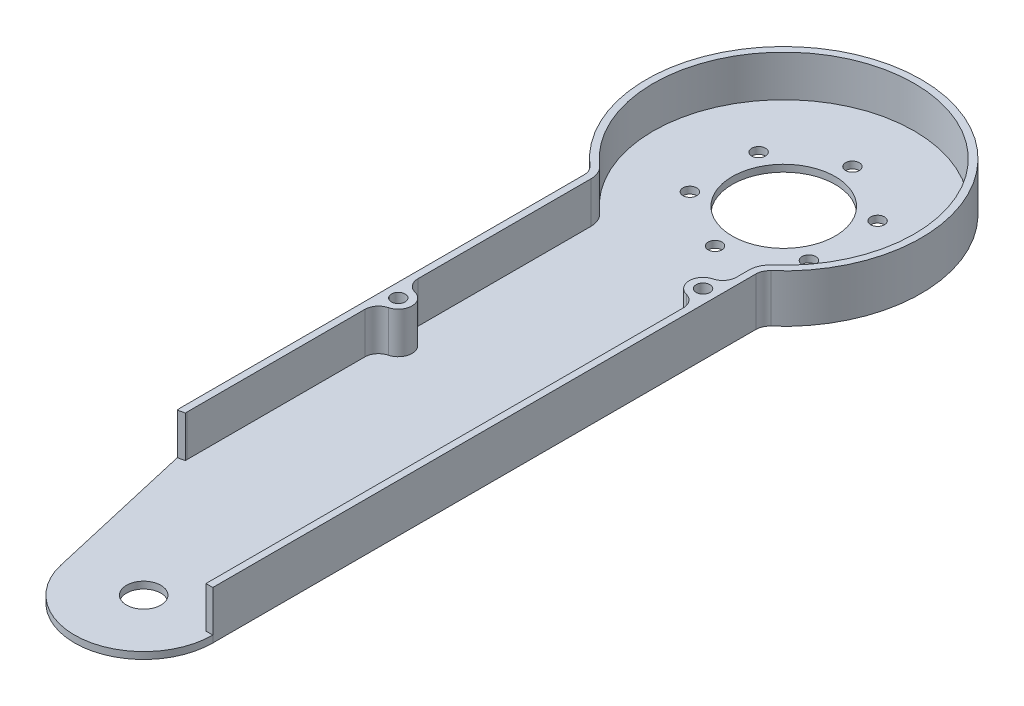
ISO-10303-21;
HEADER;
FILE_DESCRIPTION(('STEP AP214'),'2;1');
FILE_NAME('part.step','',(''),(''),'','','');
FILE_SCHEMA(('AUTOMOTIVE_DESIGN { 1 0 10303 214 1 1 1 1 }'));
ENDSEC;
DATA;
#1=APPLICATION_CONTEXT('core data for automotive mechanical design processes');
#2=APPLICATION_PROTOCOL_DEFINITION('international standard','automotive_design',2000,#1);
#3=PRODUCT_CONTEXT('',#1,'mechanical');
#4=PRODUCT('Part','Part','',(#3));
#5=PRODUCT_RELATED_PRODUCT_CATEGORY('part','',(#4));
#6=PRODUCT_DEFINITION_FORMATION('','',#4);
#7=PRODUCT_DEFINITION_CONTEXT('part definition',#1,'design');
#8=PRODUCT_DEFINITION('design','',#6,#7);
#9=PRODUCT_DEFINITION_SHAPE('','',#8);
#10=(LENGTH_UNIT() NAMED_UNIT(*) SI_UNIT(.MILLI.,.METRE.));
#11=(NAMED_UNIT(*) PLANE_ANGLE_UNIT() SI_UNIT($,.RADIAN.));
#12=(NAMED_UNIT(*) SI_UNIT($,.STERADIAN.) SOLID_ANGLE_UNIT());
#13=UNCERTAINTY_MEASURE_WITH_UNIT(LENGTH_MEASURE(1.E-05),#10,'distance_accuracy_value','');
#14=(GEOMETRIC_REPRESENTATION_CONTEXT(3) GLOBAL_UNCERTAINTY_ASSIGNED_CONTEXT((#13)) GLOBAL_UNIT_ASSIGNED_CONTEXT((#10,
#11,#12)) REPRESENTATION_CONTEXT('',''));
#15=CARTESIAN_POINT('',(0.,0.,0.));
#16=DIRECTION('',(0.,0.,1.));
#17=DIRECTION('',(1.,0.,0.));
#18=AXIS2_PLACEMENT_3D('',#15,#16,#17);
#19=CARTESIAN_POINT('',(-15.875,8.89,96.0278686449149));
#20=DIRECTION('',(0.974475103799754,0.,-0.224495594777402));
#21=DIRECTION('',(-0.224495594777402,0.,-0.974475103799754));
#22=AXIS2_PLACEMENT_3D('',#19,#20,#21);
#23=PLANE('',#22);
#24=DIRECTION('',(0.224495594777402,0.,0.974475103799754));
#25=VECTOR('',#24,1.);
#26=CARTESIAN_POINT('',(-15.875,1.27,96.0278686449149));
#27=LINE('',#26,#25);
#28=CARTESIAN_POINT('',(-15.8101667636514,1.27,96.3092923173177));
#29=VERTEX_POINT('',#28);
#30=CARTESIAN_POINT('',(-9.36239643829617,1.27,124.297332186463));
#31=VERTEX_POINT('',#30);
#32=EDGE_CURVE('E394',#29,#31,#27,.T.);
#33=ORIENTED_EDGE('',*,*,#32,.F.);
#34=DIRECTION('',(0.,-1.,0.));
#35=VECTOR('',#34,1.);
#36=CARTESIAN_POINT('',(-15.8101667636514,8.89,96.3092923173177));
#37=LINE('',#36,#35);
#38=CARTESIAN_POINT('',(-15.8101667636514,0.,96.3092923173177));
#39=VERTEX_POINT('',#38);
#40=EDGE_CURVE('E237',#29,#39,#37,.T.);
#41=ORIENTED_EDGE('',*,*,#40,.T.);
#42=DIRECTION('',(0.224495594777402,0.,0.974475103799754));
#43=VECTOR('',#42,1.);
#44=CARTESIAN_POINT('',(-15.875,0.,96.0278686449149));
#45=LINE('',#44,#43);
#46=CARTESIAN_POINT('',(-9.36239643829617,0.,124.297332186463));
#47=VERTEX_POINT('',#46);
#48=EDGE_CURVE('E528',#39,#47,#45,.T.);
#49=ORIENTED_EDGE('',*,*,#48,.T.);
#50=DIRECTION('',(0.,-1.,0.));
#51=VECTOR('',#50,1.);
#52=CARTESIAN_POINT('',(-9.36239643829617,8.89,124.297332186463));
#53=LINE('',#52,#51);
#54=EDGE_CURVE('E245',#31,#47,#53,.T.);
#55=ORIENTED_EDGE('',*,*,#54,.F.);
#56=EDGE_LOOP('',(#33,#41,#49,#55));
#57=FACE_BOUND('',#56,.T.);
#58=ADVANCED_FACE('F47',(#57),#23,.F.);
#59=CARTESIAN_POINT('',(3.09317439494254,8.89,121.427868644915));
#60=DIRECTION('',(0.,-1.,0.));
#61=DIRECTION('',(0.,0.,-1.));
#62=AXIS2_PLACEMENT_3D('',#59,#60,#61);
#63=CYLINDRICAL_SURFACE('',#62,12.7818256050575);
#64=CARTESIAN_POINT('',(3.09317439494254,1.27,121.427868644915));
#65=DIRECTION('',(0.,1.,0.));
#66=DIRECTION('',(0.,0.,1.));
#67=AXIS2_PLACEMENT_3D('',#64,#65,#66);
#68=CIRCLE('',#67,12.7818256050575);
#69=CARTESIAN_POINT('',(15.875,1.27,121.427868644915));
#70=VERTEX_POINT('',#69);
#71=EDGE_CURVE('E361',#31,#70,#68,.T.);
#72=ORIENTED_EDGE('',*,*,#71,.F.);
#73=ORIENTED_EDGE('',*,*,#54,.T.);
#74=CARTESIAN_POINT('',(3.09317439494254,0.,121.427868644915));
#75=DIRECTION('',(0.,1.,0.));
#76=DIRECTION('',(0.,0.,1.));
#77=AXIS2_PLACEMENT_3D('',#74,#75,#76);
#78=CIRCLE('',#77,12.7818256050575);
#79=CARTESIAN_POINT('',(15.875,0.,121.427868644915));
#80=VERTEX_POINT('',#79);
#81=EDGE_CURVE('E532',#47,#80,#78,.T.);
#82=ORIENTED_EDGE('',*,*,#81,.T.);
#83=DIRECTION('',(0.,-1.,0.));
#84=VECTOR('',#83,1.);
#85=CARTESIAN_POINT('',(15.875,8.89,121.427868644915));
#86=LINE('',#85,#84);
#87=EDGE_CURVE('E520',#70,#80,#86,.T.);
#88=ORIENTED_EDGE('',*,*,#87,.F.);
#89=EDGE_LOOP('',(#72,#73,#82,#88));
#90=FACE_BOUND('',#89,.T.);
#91=ADVANCED_FACE('F557',(#90),#63,.T.);
#92=CARTESIAN_POINT('',(0.,8.89,-12.7));
#93=DIRECTION('',(0.,-1.,0.));
#94=DIRECTION('',(0.,0.,-1.));
#95=AXIS2_PLACEMENT_3D('',#92,#93,#94);
#96=CYLINDRICAL_SURFACE('',#95,1.27);
#97=CARTESIAN_POINT('',(0.,0.,-12.7));
#98=DIRECTION('',(0.,1.,0.));
#99=DIRECTION('',(0.,0.,1.));
#100=AXIS2_PLACEMENT_3D('',#97,#98,#99);
#101=CIRCLE('',#100,1.27);
#102=CARTESIAN_POINT('',(0.,0.,-11.43));
#103=VERTEX_POINT('',#102);
#104=EDGE_CURVE('E504',#103,#103,#101,.T.);
#105=ORIENTED_EDGE('',*,*,#104,.F.);
#106=EDGE_LOOP('',(#105));
#107=FACE_BOUND('',#106,.T.);
#108=CARTESIAN_POINT('',(0.,1.27,-12.7));
#109=DIRECTION('',(0.,1.,0.));
#110=DIRECTION('',(0.,0.,1.));
#111=AXIS2_PLACEMENT_3D('',#108,#109,#110);
#112=CIRCLE('',#111,1.27);
#113=CARTESIAN_POINT('',(0.,1.27,-11.43));
#114=VERTEX_POINT('',#113);
#115=EDGE_CURVE('E428',#114,#114,#112,.T.);
#116=ORIENTED_EDGE('',*,*,#115,.T.);
#117=EDGE_LOOP('',(#116));
#118=FACE_BOUND('',#117,.T.);
#119=ADVANCED_FACE('F645',(#107,#118),#96,.F.);
#120=CARTESIAN_POINT('',(10.9985226280624,8.89,-6.35));
#121=DIRECTION('',(0.,-1.,0.));
#122=DIRECTION('',(0.,0.,-1.));
#123=AXIS2_PLACEMENT_3D('',#120,#121,#122);
#124=CYLINDRICAL_SURFACE('',#123,1.27);
#125=CARTESIAN_POINT('',(10.9985226280624,0.,-6.35));
#126=DIRECTION('',(0.,1.,0.));
#127=DIRECTION('',(0.,0.,1.));
#128=AXIS2_PLACEMENT_3D('',#125,#126,#127);
#129=CIRCLE('',#128,1.27);
#130=CARTESIAN_POINT('',(10.9985226280624,0.,-5.08));
#131=VERTEX_POINT('',#130);
#132=EDGE_CURVE('E500',#131,#131,#129,.T.);
#133=ORIENTED_EDGE('',*,*,#132,.F.);
#134=EDGE_LOOP('',(#133));
#135=FACE_BOUND('',#134,.T.);
#136=CARTESIAN_POINT('',(10.9985226280624,1.27,-6.35));
#137=DIRECTION('',(0.,1.,0.));
#138=DIRECTION('',(0.,0.,1.));
#139=AXIS2_PLACEMENT_3D('',#136,#137,#138);
#140=CIRCLE('',#139,1.27);
#141=CARTESIAN_POINT('',(10.9985226280624,1.27,-5.08));
#142=VERTEX_POINT('',#141);
#143=EDGE_CURVE('E433',#142,#142,#140,.T.);
#144=ORIENTED_EDGE('',*,*,#143,.T.);
#145=EDGE_LOOP('',(#144));
#146=FACE_BOUND('',#145,.T.);
#147=ADVANCED_FACE('F721',(#135,#146),#124,.F.);
#148=CARTESIAN_POINT('',(10.9985226280624,8.89,6.35));
#149=DIRECTION('',(0.,-1.,0.));
#150=DIRECTION('',(0.,0.,-1.));
#151=AXIS2_PLACEMENT_3D('',#148,#149,#150);
#152=CYLINDRICAL_SURFACE('',#151,1.27);
#153=CARTESIAN_POINT('',(10.9985226280624,0.,6.35));
#154=DIRECTION('',(0.,1.,0.));
#155=DIRECTION('',(0.,0.,1.));
#156=AXIS2_PLACEMENT_3D('',#153,#154,#155);
#157=CIRCLE('',#156,1.27);
#158=CARTESIAN_POINT('',(10.9985226280624,0.,7.62));
#159=VERTEX_POINT('',#158);
#160=EDGE_CURVE('E496',#159,#159,#157,.T.);
#161=ORIENTED_EDGE('',*,*,#160,.F.);
#162=EDGE_LOOP('',(#161));
#163=FACE_BOUND('',#162,.T.);
#164=CARTESIAN_POINT('',(10.9985226280624,1.27,6.35));
#165=DIRECTION('',(0.,1.,0.));
#166=DIRECTION('',(0.,0.,1.));
#167=AXIS2_PLACEMENT_3D('',#164,#165,#166);
#168=CIRCLE('',#167,1.27);
#169=CARTESIAN_POINT('',(10.9985226280624,1.27,7.62));
#170=VERTEX_POINT('',#169);
#171=EDGE_CURVE('E437',#170,#170,#168,.T.);
#172=ORIENTED_EDGE('',*,*,#171,.T.);
#173=EDGE_LOOP('',(#172));
#174=FACE_BOUND('',#173,.T.);
#175=ADVANCED_FACE('F717',(#163,#174),#152,.F.);
#176=CARTESIAN_POINT('',(0.,8.89,12.7));
#177=DIRECTION('',(0.,-1.,0.));
#178=DIRECTION('',(0.,0.,-1.));
#179=AXIS2_PLACEMENT_3D('',#176,#177,#178);
#180=CYLINDRICAL_SURFACE('',#179,1.27);
#181=CARTESIAN_POINT('',(0.,0.,12.7));
#182=DIRECTION('',(0.,1.,0.));
#183=DIRECTION('',(0.,0.,1.));
#184=AXIS2_PLACEMENT_3D('',#181,#182,#183);
#185=CIRCLE('',#184,1.27);
#186=CARTESIAN_POINT('',(0.,0.,13.97));
#187=VERTEX_POINT('',#186);
#188=EDGE_CURVE('E492',#187,#187,#185,.T.);
#189=ORIENTED_EDGE('',*,*,#188,.F.);
#190=EDGE_LOOP('',(#189));
#191=FACE_BOUND('',#190,.T.);
#192=CARTESIAN_POINT('',(0.,1.27,12.7));
#193=DIRECTION('',(0.,1.,0.));
#194=DIRECTION('',(0.,0.,1.));
#195=AXIS2_PLACEMENT_3D('',#192,#193,#194);
#196=CIRCLE('',#195,1.27);
#197=CARTESIAN_POINT('',(0.,1.27,13.97));
#198=VERTEX_POINT('',#197);
#199=EDGE_CURVE('E441',#198,#198,#196,.T.);
#200=ORIENTED_EDGE('',*,*,#199,.T.);
#201=EDGE_LOOP('',(#200));
#202=FACE_BOUND('',#201,.T.);
#203=ADVANCED_FACE('F713',(#191,#202),#180,.F.);
#204=CARTESIAN_POINT('',(-10.9985226280624,8.89,6.35000000000001));
#205=DIRECTION('',(0.,-1.,0.));
#206=DIRECTION('',(0.,0.,-1.));
#207=AXIS2_PLACEMENT_3D('',#204,#205,#206);
#208=CYLINDRICAL_SURFACE('',#207,1.27);
#209=CARTESIAN_POINT('',(-10.9985226280624,0.,6.35000000000001));
#210=DIRECTION('',(0.,1.,0.));
#211=DIRECTION('',(0.,0.,1.));
#212=AXIS2_PLACEMENT_3D('',#209,#210,#211);
#213=CIRCLE('',#212,1.27);
#214=CARTESIAN_POINT('',(-10.9985226280624,0.,7.62000000000001));
#215=VERTEX_POINT('',#214);
#216=EDGE_CURVE('E488',#215,#215,#213,.T.);
#217=ORIENTED_EDGE('',*,*,#216,.F.);
#218=EDGE_LOOP('',(#217));
#219=FACE_BOUND('',#218,.T.);
#220=CARTESIAN_POINT('',(-10.9985226280624,1.27,6.35000000000001));
#221=DIRECTION('',(0.,1.,0.));
#222=DIRECTION('',(0.,0.,1.));
#223=AXIS2_PLACEMENT_3D('',#220,#221,#222);
#224=CIRCLE('',#223,1.27);
#225=CARTESIAN_POINT('',(-10.9985226280624,1.27,7.62000000000001));
#226=VERTEX_POINT('',#225);
#227=EDGE_CURVE('E445',#226,#226,#224,.T.);
#228=ORIENTED_EDGE('',*,*,#227,.T.);
#229=EDGE_LOOP('',(#228));
#230=FACE_BOUND('',#229,.T.);
#231=ADVANCED_FACE('F709',(#219,#230),#208,.F.);
#232=CARTESIAN_POINT('',(-10.9985226280624,8.89,-6.35));
#233=DIRECTION('',(0.,-1.,0.));
#234=DIRECTION('',(0.,0.,-1.));
#235=AXIS2_PLACEMENT_3D('',#232,#233,#234);
#236=CYLINDRICAL_SURFACE('',#235,1.27);
#237=CARTESIAN_POINT('',(-10.9985226280624,0.,-6.35));
#238=DIRECTION('',(0.,1.,0.));
#239=DIRECTION('',(0.,0.,1.));
#240=AXIS2_PLACEMENT_3D('',#237,#238,#239);
#241=CIRCLE('',#240,1.27);
#242=CARTESIAN_POINT('',(-10.9985226280624,0.,-5.08));
#243=VERTEX_POINT('',#242);
#244=EDGE_CURVE('E481',#243,#243,#241,.T.);
#245=ORIENTED_EDGE('',*,*,#244,.F.);
#246=EDGE_LOOP('',(#245));
#247=FACE_BOUND('',#246,.T.);
#248=CARTESIAN_POINT('',(-10.9985226280624,1.27,-6.35));
#249=DIRECTION('',(0.,1.,0.));
#250=DIRECTION('',(0.,0.,1.));
#251=AXIS2_PLACEMENT_3D('',#248,#249,#250);
#252=CIRCLE('',#251,1.27);
#253=CARTESIAN_POINT('',(-10.9985226280624,1.27,-5.08));
#254=VERTEX_POINT('',#253);
#255=EDGE_CURVE('E449',#254,#254,#252,.T.);
#256=ORIENTED_EDGE('',*,*,#255,.T.);
#257=EDGE_LOOP('',(#256));
#258=FACE_BOUND('',#257,.T.);
#259=ADVANCED_FACE('F702',(#247,#258),#236,.F.);
#260=CARTESIAN_POINT('',(3.09317439494254,8.89,121.427868644915));
#261=DIRECTION('',(0.,-1.,0.));
#262=DIRECTION('',(0.,0.,-1.));
#263=AXIS2_PLACEMENT_3D('',#260,#261,#262);
#264=CYLINDRICAL_SURFACE('',#263,3.175);
#265=CARTESIAN_POINT('',(3.09317439494254,0.,121.427868644915));
#266=DIRECTION('',(0.,1.,0.));
#267=DIRECTION('',(0.,0.,1.));
#268=AXIS2_PLACEMENT_3D('',#265,#266,#267);
#269=CIRCLE('',#268,3.175);
#270=CARTESIAN_POINT('',(3.09317439494254,0.,124.602868644915));
#271=VERTEX_POINT('',#270);
#272=EDGE_CURVE('E469',#271,#271,#269,.T.);
#273=ORIENTED_EDGE('',*,*,#272,.F.);
#274=EDGE_LOOP('',(#273));
#275=FACE_BOUND('',#274,.T.);
#276=CARTESIAN_POINT('',(3.09317439494254,1.27,121.427868644915));
#277=DIRECTION('',(0.,1.,0.));
#278=DIRECTION('',(0.,0.,1.));
#279=AXIS2_PLACEMENT_3D('',#276,#277,#278);
#280=CIRCLE('',#279,3.175);
#281=CARTESIAN_POINT('',(3.09317439494254,1.27,124.602868644915));
#282=VERTEX_POINT('',#281);
#283=EDGE_CURVE('E335',#282,#282,#280,.T.);
#284=ORIENTED_EDGE('',*,*,#283,.T.);
#285=EDGE_LOOP('',(#284));
#286=FACE_BOUND('',#285,.T.);
#287=ADVANCED_FACE('F694',(#275,#286),#264,.F.);
#288=CARTESIAN_POINT('',(0.,8.89,0.));
#289=DIRECTION('',(0.,-1.,0.));
#290=DIRECTION('',(0.,0.,-1.));
#291=AXIS2_PLACEMENT_3D('',#288,#289,#290);
#292=CYLINDRICAL_SURFACE('',#291,9.525);
#293=CARTESIAN_POINT('',(0.,0.,0.));
#294=DIRECTION('',(0.,1.,0.));
#295=DIRECTION('',(0.,0.,1.));
#296=AXIS2_PLACEMENT_3D('',#293,#294,#295);
#297=CIRCLE('',#296,9.525);
#298=CARTESIAN_POINT('',(0.,0.,9.525));
#299=VERTEX_POINT('',#298);
#300=EDGE_CURVE('E404',#299,#299,#297,.T.);
#301=ORIENTED_EDGE('',*,*,#300,.F.);
#302=EDGE_LOOP('',(#301));
#303=FACE_BOUND('',#302,.T.);
#304=CARTESIAN_POINT('',(0.,1.27,0.));
#305=DIRECTION('',(0.,1.,0.));
#306=DIRECTION('',(0.,0.,1.));
#307=AXIS2_PLACEMENT_3D('',#304,#305,#306);
#308=CIRCLE('',#307,9.525);
#309=CARTESIAN_POINT('',(0.,1.27,9.525));
#310=VERTEX_POINT('',#309);
#311=EDGE_CURVE('E373',#310,#310,#308,.T.);
#312=ORIENTED_EDGE('',*,*,#311,.T.);
#313=EDGE_LOOP('',(#312));
#314=FACE_BOUND('',#313,.T.);
#315=ADVANCED_FACE('F691',(#303,#314),#292,.F.);
#316=CARTESIAN_POINT('',(0.,8.89,0.));
#317=DIRECTION('',(0.,1.,0.));
#318=DIRECTION('',(0.,0.,1.));
#319=AXIS2_PLACEMENT_3D('',#316,#317,#318);
#320=PLANE('',#319);
#321=DIRECTION('',(-0.974475103799754,0.,0.224495594777402));
#322=VECTOR('',#321,1.);
#323=CARTESIAN_POINT('',(-15.8101667636514,8.89,96.3092923173177));
#324=LINE('',#323,#322);
#325=CARTESIAN_POINT('',(-14.5725833818257,8.89,96.0241829119504));
#326=VERTEX_POINT('',#325);
#327=CARTESIAN_POINT('',(-15.8101667636514,8.89,96.3092923173177));
#328=VERTEX_POINT('',#327);
#329=EDGE_CURVE('E208',#326,#328,#324,.T.);
#330=ORIENTED_EDGE('',*,*,#329,.F.);
#331=CARTESIAN_POINT('',(-13.335,8.89,95.7390735065831));
#332=DIRECTION('',(0.,1.,0.));
#333=DIRECTION('',(0.,0.,1.));
#334=AXIS2_PLACEMENT_3D('',#331,#332,#333);
#335=CIRCLE('',#334,1.27);
#336=CARTESIAN_POINT('',(-14.605,8.89,95.7390735065831));
#337=VERTEX_POINT('',#336);
#338=EDGE_CURVE('E381',#337,#326,#335,.T.);
#339=ORIENTED_EDGE('',*,*,#338,.F.);
#340=DIRECTION('',(0.,0.,1.));
#341=VECTOR('',#340,1.);
#342=CARTESIAN_POINT('',(-14.605,8.89,19.8278686449149));
#343=LINE('',#342,#341);
#344=CARTESIAN_POINT('',(-14.605,8.89,62.8465574945983));
#345=VERTEX_POINT('',#344);
#346=EDGE_CURVE('E359',#345,#337,#343,.T.);
#347=ORIENTED_EDGE('',*,*,#346,.F.);
#348=CARTESIAN_POINT('',(-12.065,8.89,62.8465574945983));
#349=DIRECTION('',(0.,1.,0.));
#350=DIRECTION('',(0.,0.,1.));
#351=AXIS2_PLACEMENT_3D('',#348,#349,#350);
#352=CIRCLE('',#351,2.54);
#353=CARTESIAN_POINT('',(-12.7,8.89,60.3872130697566));
#354=VERTEX_POINT('',#353);
#355=EDGE_CURVE('E11',#345,#354,#352,.F.);
#356=ORIENTED_EDGE('',*,*,#355,.T.);
#357=CARTESIAN_POINT('',(-13.335,8.89,57.9278686449149));
#358=DIRECTION('',(0.,1.,0.));
#359=DIRECTION('',(0.,0.,1.));
#360=AXIS2_PLACEMENT_3D('',#357,#358,#359);
#361=CIRCLE('',#360,2.54);
#362=CARTESIAN_POINT('',(-12.7,8.89,55.4685242200732));
#363=VERTEX_POINT('',#362);
#364=EDGE_CURVE('E370',#354,#363,#361,.T.);
#365=ORIENTED_EDGE('',*,*,#364,.T.);
#366=CARTESIAN_POINT('',(-12.065,8.89,53.0091797952315));
#367=DIRECTION('',(0.,1.,0.));
#368=DIRECTION('',(0.,0.,1.));
#369=AXIS2_PLACEMENT_3D('',#366,#367,#368);
#370=CIRCLE('',#369,2.54);
#371=CARTESIAN_POINT('',(-14.605,8.89,53.0091797952315));
#372=VERTEX_POINT('',#371);
#373=EDGE_CURVE('E56',#363,#372,#370,.F.);
#374=ORIENTED_EDGE('',*,*,#373,.T.);
#375=CARTESIAN_POINT('',(-14.605,8.89,21.0126479768734));
#376=VERTEX_POINT('',#375);
#377=EDGE_CURVE('E419',#376,#372,#343,.T.);
#378=ORIENTED_EDGE('',*,*,#377,.F.);
#379=CARTESIAN_POINT('',(-18.415,8.89,21.0126479768734));
#380=DIRECTION('',(0.,1.,0.));
#381=DIRECTION('',(0.,0.,1.));
#382=AXIS2_PLACEMENT_3D('',#379,#380,#381);
#383=CIRCLE('',#382,3.81);
#384=CARTESIAN_POINT('',(-15.9038636363636,8.89,18.1472868891179));
#385=VERTEX_POINT('',#384);
#386=EDGE_CURVE('E416',#385,#376,#383,.F.);
#387=ORIENTED_EDGE('',*,*,#386,.F.);
#388=CARTESIAN_POINT('',(0.,8.89,0.));
#389=DIRECTION('',(0.,1.,0.));
#390=DIRECTION('',(0.,0.,1.));
#391=AXIS2_PLACEMENT_3D('',#388,#389,#390);
#392=CIRCLE('',#391,24.13);
#393=CARTESIAN_POINT('',(15.9038636363636,8.89,18.1472868891179));
#394=VERTEX_POINT('',#393);
#395=EDGE_CURVE('E353',#394,#385,#392,.T.);
#396=ORIENTED_EDGE('',*,*,#395,.F.);
#397=CARTESIAN_POINT('',(18.415,8.89,21.0126479768734));
#398=DIRECTION('',(0.,1.,0.));
#399=DIRECTION('',(0.,0.,1.));
#400=AXIS2_PLACEMENT_3D('',#397,#398,#399);
#401=CIRCLE('',#400,3.81);
#402=CARTESIAN_POINT('',(14.605,8.89,21.0126479768734));
#403=VERTEX_POINT('',#402);
#404=EDGE_CURVE('E413',#403,#394,#401,.F.);
#405=ORIENTED_EDGE('',*,*,#404,.F.);
#406=DIRECTION('',(0.,0.,-1.));
#407=VECTOR('',#406,1.);
#408=CARTESIAN_POINT('',(14.605,8.89,96.0278686449149));
#409=LINE('',#408,#407);
#410=CARTESIAN_POINT('',(14.605,8.89,23.3319110107138));
#411=VERTEX_POINT('',#410);
#412=EDGE_CURVE('E325',#411,#403,#409,.T.);
#413=ORIENTED_EDGE('',*,*,#412,.F.);
#414=CARTESIAN_POINT('',(12.065,8.89,23.3319110107138));
#415=DIRECTION('',(0.,1.,0.));
#416=DIRECTION('',(0.,0.,1.));
#417=AXIS2_PLACEMENT_3D('',#414,#415,#416);
#418=CIRCLE('',#417,2.54);
#419=CARTESIAN_POINT('',(12.7,8.89,25.7912554355555));
#420=VERTEX_POINT('',#419);
#421=EDGE_CURVE('E317',#411,#420,#418,.F.);
#422=ORIENTED_EDGE('',*,*,#421,.T.);
#423=CARTESIAN_POINT('',(13.335,8.89,28.2505998603972));
#424=DIRECTION('',(0.,1.,0.));
#425=DIRECTION('',(0.,0.,1.));
#426=AXIS2_PLACEMENT_3D('',#423,#424,#425);
#427=CIRCLE('',#426,2.54);
#428=CARTESIAN_POINT('',(12.7,8.89,30.709944285239));
#429=VERTEX_POINT('',#428);
#430=EDGE_CURVE('E323',#420,#429,#427,.T.);
#431=ORIENTED_EDGE('',*,*,#430,.T.);
#432=CARTESIAN_POINT('',(12.065,8.89,33.1692887100807));
#433=DIRECTION('',(0.,1.,0.));
#434=DIRECTION('',(0.,0.,1.));
#435=AXIS2_PLACEMENT_3D('',#432,#433,#434);
#436=CIRCLE('',#435,2.54);
#437=CARTESIAN_POINT('',(14.605,8.89,33.1692887100807));
#438=VERTEX_POINT('',#437);
#439=EDGE_CURVE('E314',#429,#438,#436,.F.);
#440=ORIENTED_EDGE('',*,*,#439,.T.);
#441=CARTESIAN_POINT('',(14.605,8.89,121.427868644915));
#442=VERTEX_POINT('',#441);
#443=EDGE_CURVE('E409',#442,#438,#409,.T.);
#444=ORIENTED_EDGE('',*,*,#443,.F.);
#445=DIRECTION('',(-1.,0.,0.));
#446=VECTOR('',#445,1.);
#447=CARTESIAN_POINT('',(15.875,8.89,121.427868644915));
#448=LINE('',#447,#446);
#449=CARTESIAN_POINT('',(15.875,8.89,121.427868644915));
#450=VERTEX_POINT('',#449);
#451=EDGE_CURVE('E218',#442,#450,#448,.F.);
#452=ORIENTED_EDGE('',*,*,#451,.T.);
#453=DIRECTION('',(0.,0.,-1.));
#454=VECTOR('',#453,1.);
#455=CARTESIAN_POINT('',(15.875,8.89,96.0278686449149));
#456=LINE('',#455,#454);
#457=CARTESIAN_POINT('',(15.875,8.89,21.0126479768734));
#458=VERTEX_POINT('',#457);
#459=EDGE_CURVE('E516',#450,#458,#456,.T.);
#460=ORIENTED_EDGE('',*,*,#459,.T.);
#461=CARTESIAN_POINT('',(18.415,8.89,21.0126479768734));
#462=DIRECTION('',(0.,1.,0.));
#463=DIRECTION('',(0.,0.,1.));
#464=AXIS2_PLACEMENT_3D('',#461,#462,#463);
#465=CIRCLE('',#464,2.54);
#466=CARTESIAN_POINT('',(16.7409090909091,8.89,19.1024072517031));
#467=VERTEX_POINT('',#466);
#468=EDGE_CURVE('E272',#458,#467,#465,.F.);
#469=ORIENTED_EDGE('',*,*,#468,.T.);
#470=CARTESIAN_POINT('',(0.,8.89,0.));
#471=DIRECTION('',(0.,1.,0.));
#472=DIRECTION('',(0.,0.,1.));
#473=AXIS2_PLACEMENT_3D('',#470,#471,#472);
#474=CIRCLE('',#473,25.4);
#475=CARTESIAN_POINT('',(-16.7409090909091,8.89,19.1024072517031));
#476=VERTEX_POINT('',#475);
#477=EDGE_CURVE('E509',#467,#476,#474,.T.);
#478=ORIENTED_EDGE('',*,*,#477,.T.);
#479=CARTESIAN_POINT('',(-18.415,8.89,21.0126479768734));
#480=DIRECTION('',(0.,1.,0.));
#481=DIRECTION('',(0.,0.,1.));
#482=AXIS2_PLACEMENT_3D('',#479,#480,#481);
#483=CIRCLE('',#482,2.54);
#484=CARTESIAN_POINT('',(-15.875,8.89,21.0126479768734));
#485=VERTEX_POINT('',#484);
#486=EDGE_CURVE('E266',#476,#485,#483,.F.);
#487=ORIENTED_EDGE('',*,*,#486,.T.);
#488=DIRECTION('',(0.,0.,1.));
#489=VECTOR('',#488,1.);
#490=CARTESIAN_POINT('',(-15.875,8.89,19.8278686449149));
#491=LINE('',#490,#489);
#492=CARTESIAN_POINT('',(-15.875,8.89,95.7390735065831));
#493=VERTEX_POINT('',#492);
#494=EDGE_CURVE('E227',#485,#493,#491,.T.);
#495=ORIENTED_EDGE('',*,*,#494,.T.);
#496=CARTESIAN_POINT('',(-13.335,8.89,95.7390735065831));
#497=DIRECTION('',(0.,1.,0.));
#498=DIRECTION('',(0.,0.,1.));
#499=AXIS2_PLACEMENT_3D('',#496,#497,#498);
#500=CIRCLE('',#499,2.54);
#501=EDGE_CURVE('E223',#493,#328,#500,.T.);
#502=ORIENTED_EDGE('',*,*,#501,.T.);
#503=EDGE_LOOP('',(#330,#339,#347,#356,#365,#374,#378,#387,#396,#405,#413,#422,#431,#440,#444,
#452,#460,#469,#478,#487,#495,#502));
#504=FACE_BOUND('',#503,.T.);
#505=CARTESIAN_POINT('',(13.335,8.89,28.2505998603972));
#506=DIRECTION('',(0.,1.,0.));
#507=DIRECTION('',(0.,0.,1.));
#508=AXIS2_PLACEMENT_3D('',#505,#506,#507);
#509=CIRCLE('',#508,1.27);
#510=CARTESIAN_POINT('',(13.335,8.89,29.5205998603972));
#511=VERTEX_POINT('',#510);
#512=EDGE_CURVE('E465',#511,#511,#509,.T.);
#513=ORIENTED_EDGE('',*,*,#512,.F.);
#514=EDGE_LOOP('',(#513));
#515=FACE_BOUND('',#514,.T.);
#516=CARTESIAN_POINT('',(-13.335,8.89,57.9278686449149));
#517=DIRECTION('',(0.,1.,0.));
#518=DIRECTION('',(0.,0.,1.));
#519=AXIS2_PLACEMENT_3D('',#516,#517,#518);
#520=CIRCLE('',#519,1.27);
#521=CARTESIAN_POINT('',(-13.335,8.89,59.1978686449149));
#522=VERTEX_POINT('',#521);
#523=EDGE_CURVE('E477',#522,#522,#520,.T.);
#524=ORIENTED_EDGE('',*,*,#523,.F.);
#525=EDGE_LOOP('',(#524));
#526=FACE_BOUND('',#525,.T.);
#527=ADVANCED_FACE('F224',(#504,#515,#526),#320,.T.);
#528=CARTESIAN_POINT('',(0.,0.,0.));
#529=DIRECTION('',(0.,1.,0.));
#530=DIRECTION('',(0.,0.,1.));
#531=AXIS2_PLACEMENT_3D('',#528,#529,#530);
#532=PLANE('',#531);
#533=ORIENTED_EDGE('',*,*,#48,.F.);
#534=CARTESIAN_POINT('',(-13.335,0.,95.7390735065831));
#535=DIRECTION('',(0.,1.,0.));
#536=DIRECTION('',(0.,0.,1.));
#537=AXIS2_PLACEMENT_3D('',#534,#535,#536);
#538=CIRCLE('',#537,2.54);
#539=CARTESIAN_POINT('',(-15.875,0.,95.7390735065831));
#540=VERTEX_POINT('',#539);
#541=EDGE_CURVE('E239',#39,#540,#538,.F.);
#542=ORIENTED_EDGE('',*,*,#541,.T.);
#543=DIRECTION('',(0.,0.,1.));
#544=VECTOR('',#543,1.);
#545=CARTESIAN_POINT('',(-15.875,0.,19.8278686449149));
#546=LINE('',#545,#544);
#547=CARTESIAN_POINT('',(-15.875,0.,21.0126479768734));
#548=VERTEX_POINT('',#547);
#549=EDGE_CURVE('E524',#548,#540,#546,.T.);
#550=ORIENTED_EDGE('',*,*,#549,.F.);
#551=CARTESIAN_POINT('',(-18.415,0.,21.0126479768734));
#552=DIRECTION('',(0.,1.,0.));
#553=DIRECTION('',(0.,0.,1.));
#554=AXIS2_PLACEMENT_3D('',#551,#552,#553);
#555=CIRCLE('',#554,2.54);
#556=CARTESIAN_POINT('',(-16.7409090909091,0.,19.1024072517031));
#557=VERTEX_POINT('',#556);
#558=EDGE_CURVE('E263',#548,#557,#555,.T.);
#559=ORIENTED_EDGE('',*,*,#558,.T.);
#560=CARTESIAN_POINT('',(0.,0.,0.));
#561=DIRECTION('',(0.,1.,0.));
#562=DIRECTION('',(0.,0.,1.));
#563=AXIS2_PLACEMENT_3D('',#560,#561,#562);
#564=CIRCLE('',#563,25.4);
#565=CARTESIAN_POINT('',(16.7409090909091,0.,19.1024072517031));
#566=VERTEX_POINT('',#565);
#567=EDGE_CURVE('E508',#566,#557,#564,.T.);
#568=ORIENTED_EDGE('',*,*,#567,.F.);
#569=CARTESIAN_POINT('',(18.415,0.,21.0126479768734));
#570=DIRECTION('',(0.,1.,0.));
#571=DIRECTION('',(0.,0.,1.));
#572=AXIS2_PLACEMENT_3D('',#569,#570,#571);
#573=CIRCLE('',#572,2.54);
#574=CARTESIAN_POINT('',(15.875,0.,21.0126479768734));
#575=VERTEX_POINT('',#574);
#576=EDGE_CURVE('E269',#566,#575,#573,.T.);
#577=ORIENTED_EDGE('',*,*,#576,.T.);
#578=DIRECTION('',(0.,0.,-1.));
#579=VECTOR('',#578,1.);
#580=CARTESIAN_POINT('',(15.875,0.,96.0278686449149));
#581=LINE('',#580,#579);
#582=EDGE_CURVE('E513',#80,#575,#581,.T.);
#583=ORIENTED_EDGE('',*,*,#582,.F.);
#584=ORIENTED_EDGE('',*,*,#81,.F.);
#585=EDGE_LOOP('',(#533,#542,#550,#559,#568,#577,#583,#584));
#586=FACE_BOUND('',#585,.T.);
#587=ORIENTED_EDGE('',*,*,#104,.T.);
#588=EDGE_LOOP('',(#587));
#589=FACE_BOUND('',#588,.T.);
#590=ORIENTED_EDGE('',*,*,#132,.T.);
#591=EDGE_LOOP('',(#590));
#592=FACE_BOUND('',#591,.T.);
#593=ORIENTED_EDGE('',*,*,#160,.T.);
#594=EDGE_LOOP('',(#593));
#595=FACE_BOUND('',#594,.T.);
#596=ORIENTED_EDGE('',*,*,#188,.T.);
#597=EDGE_LOOP('',(#596));
#598=FACE_BOUND('',#597,.T.);
#599=ORIENTED_EDGE('',*,*,#216,.T.);
#600=EDGE_LOOP('',(#599));
#601=FACE_BOUND('',#600,.T.);
#602=ORIENTED_EDGE('',*,*,#244,.T.);
#603=EDGE_LOOP('',(#602));
#604=FACE_BOUND('',#603,.T.);
#605=CARTESIAN_POINT('',(-13.335,0.,57.9278686449149));
#606=DIRECTION('',(0.,1.,0.));
#607=DIRECTION('',(0.,0.,1.));
#608=AXIS2_PLACEMENT_3D('',#605,#606,#607);
#609=CIRCLE('',#608,1.27);
#610=CARTESIAN_POINT('',(-13.335,0.,59.1978686449149));
#611=VERTEX_POINT('',#610);
#612=EDGE_CURVE('E476',#611,#611,#609,.T.);
#613=ORIENTED_EDGE('',*,*,#612,.T.);
#614=EDGE_LOOP('',(#613));
#615=FACE_BOUND('',#614,.T.);
#616=ORIENTED_EDGE('',*,*,#272,.T.);
#617=EDGE_LOOP('',(#616));
#618=FACE_BOUND('',#617,.T.);
#619=CARTESIAN_POINT('',(13.335,0.,28.2505998603972));
#620=DIRECTION('',(0.,1.,0.));
#621=DIRECTION('',(0.,0.,1.));
#622=AXIS2_PLACEMENT_3D('',#619,#620,#621);
#623=CIRCLE('',#622,1.27);
#624=CARTESIAN_POINT('',(13.335,0.,29.5205998603972));
#625=VERTEX_POINT('',#624);
#626=EDGE_CURVE('E464',#625,#625,#623,.T.);
#627=ORIENTED_EDGE('',*,*,#626,.T.);
#628=EDGE_LOOP('',(#627));
#629=FACE_BOUND('',#628,.T.);
#630=ORIENTED_EDGE('',*,*,#300,.T.);
#631=EDGE_LOOP('',(#630));
#632=FACE_BOUND('',#631,.T.);
#633=ADVANCED_FACE('F554',(#586,#589,#592,#595,#598,#601,#604,#615,#618,#629,#632),#532,.F.);
#634=CARTESIAN_POINT('',(0.,8.89,0.));
#635=DIRECTION('',(0.,-1.,0.));
#636=DIRECTION('',(0.,0.,-1.));
#637=AXIS2_PLACEMENT_3D('',#634,#635,#636);
#638=CYLINDRICAL_SURFACE('',#637,25.4);
#639=ORIENTED_EDGE('',*,*,#567,.T.);
#640=DIRECTION('',(0.,-1.,0.));
#641=VECTOR('',#640,1.);
#642=CARTESIAN_POINT('',(-16.7409090909091,8.89,19.1024072517031));
#643=LINE('',#642,#641);
#644=EDGE_CURVE('E257',#557,#476,#643,.F.);
#645=ORIENTED_EDGE('',*,*,#644,.T.);
#646=ORIENTED_EDGE('',*,*,#477,.F.);
#647=DIRECTION('',(0.,-1.,0.));
#648=VECTOR('',#647,1.);
#649=CARTESIAN_POINT('',(16.7409090909091,8.89,19.1024072517031));
#650=LINE('',#649,#648);
#651=EDGE_CURVE('E231',#467,#566,#650,.T.);
#652=ORIENTED_EDGE('',*,*,#651,.T.);
#653=EDGE_LOOP('',(#639,#645,#646,#652));
#654=FACE_BOUND('',#653,.T.);
#655=ADVANCED_FACE('F570',(#654),#638,.T.);
#656=CARTESIAN_POINT('',(-15.875,8.89,19.8278686449149));
#657=DIRECTION('',(1.,0.,0.));
#658=DIRECTION('',(0.,0.,-1.));
#659=AXIS2_PLACEMENT_3D('',#656,#657,#658);
#660=PLANE('',#659);
#661=ORIENTED_EDGE('',*,*,#549,.T.);
#662=DIRECTION('',(0.,-1.,0.));
#663=VECTOR('',#662,1.);
#664=CARTESIAN_POINT('',(-15.875,8.89,95.7390735065831));
#665=LINE('',#664,#663);
#666=EDGE_CURVE('E232',#540,#493,#665,.F.);
#667=ORIENTED_EDGE('',*,*,#666,.T.);
#668=ORIENTED_EDGE('',*,*,#494,.F.);
#669=DIRECTION('',(0.,1.,0.));
#670=VECTOR('',#669,1.);
#671=CARTESIAN_POINT('',(-15.875,0.,21.0126479768734));
#672=LINE('',#671,#670);
#673=EDGE_CURVE('E243',#485,#548,#672,.F.);
#674=ORIENTED_EDGE('',*,*,#673,.T.);
#675=EDGE_LOOP('',(#661,#667,#668,#674));
#676=FACE_BOUND('',#675,.T.);
#677=ADVANCED_FACE('F563',(#676),#660,.F.);
#678=CARTESIAN_POINT('',(15.875,8.89,96.0278686449149));
#679=DIRECTION('',(-1.,0.,0.));
#680=DIRECTION('',(0.,0.,1.));
#681=AXIS2_PLACEMENT_3D('',#678,#679,#680);
#682=PLANE('',#681);
#683=ORIENTED_EDGE('',*,*,#582,.T.);
#684=DIRECTION('',(0.,1.,0.));
#685=VECTOR('',#684,1.);
#686=CARTESIAN_POINT('',(15.875,8.89,21.0126479768734));
#687=LINE('',#686,#685);
#688=EDGE_CURVE('E260',#575,#458,#687,.T.);
#689=ORIENTED_EDGE('',*,*,#688,.T.);
#690=ORIENTED_EDGE('',*,*,#459,.F.);
#691=EDGE_CURVE('E538',#450,#70,#86,.T.);
#692=ORIENTED_EDGE('',*,*,#691,.T.);
#693=ORIENTED_EDGE('',*,*,#87,.T.);
#694=EDGE_LOOP('',(#683,#689,#690,#692,#693));
#695=FACE_BOUND('',#694,.T.);
#696=ADVANCED_FACE('F547',(#695),#682,.F.);
#697=CARTESIAN_POINT('',(-13.335,8.89,57.9278686449149));
#698=DIRECTION('',(0.,-1.,0.));
#699=DIRECTION('',(0.,0.,-1.));
#700=AXIS2_PLACEMENT_3D('',#697,#698,#699);
#701=CYLINDRICAL_SURFACE('',#700,1.27);
#702=ORIENTED_EDGE('',*,*,#523,.T.);
#703=EDGE_LOOP('',(#702));
#704=FACE_BOUND('',#703,.T.);
#705=ORIENTED_EDGE('',*,*,#612,.F.);
#706=EDGE_LOOP('',(#705));
#707=FACE_BOUND('',#706,.T.);
#708=ADVANCED_FACE('F698',(#704,#707),#701,.F.);
#709=CARTESIAN_POINT('',(13.335,8.89,28.2505998603972));
#710=DIRECTION('',(0.,-1.,0.));
#711=DIRECTION('',(0.,0.,-1.));
#712=AXIS2_PLACEMENT_3D('',#709,#710,#711);
#713=CYLINDRICAL_SURFACE('',#712,1.27);
#714=ORIENTED_EDGE('',*,*,#512,.T.);
#715=EDGE_LOOP('',(#714));
#716=FACE_BOUND('',#715,.T.);
#717=ORIENTED_EDGE('',*,*,#626,.F.);
#718=EDGE_LOOP('',(#717));
#719=FACE_BOUND('',#718,.T.);
#720=ADVANCED_FACE('F655',(#716,#719),#713,.F.);
#721=CARTESIAN_POINT('',(-13.335,8.89,95.7390735065831));
#722=DIRECTION('',(0.,-1.,0.));
#723=DIRECTION('',(0.,0.,-1.));
#724=AXIS2_PLACEMENT_3D('',#721,#722,#723);
#725=CYLINDRICAL_SURFACE('',#724,2.54);
#726=ORIENTED_EDGE('',*,*,#501,.F.);
#727=ORIENTED_EDGE('',*,*,#666,.F.);
#728=ORIENTED_EDGE('',*,*,#541,.F.);
#729=ORIENTED_EDGE('',*,*,#40,.F.);
#730=EDGE_CURVE('E212',#328,#29,#37,.T.);
#731=ORIENTED_EDGE('',*,*,#730,.F.);
#732=EDGE_LOOP('',(#726,#727,#728,#729,#731));
#733=FACE_BOUND('',#732,.T.);
#734=ADVANCED_FACE('F235',(#733),#725,.T.);
#735=CARTESIAN_POINT('',(-18.415,8.89,21.0126479768734));
#736=DIRECTION('',(0.,-1.,0.));
#737=DIRECTION('',(0.,0.,-1.));
#738=AXIS2_PLACEMENT_3D('',#735,#736,#737);
#739=CYLINDRICAL_SURFACE('',#738,2.54);
#740=ORIENTED_EDGE('',*,*,#486,.F.);
#741=ORIENTED_EDGE('',*,*,#644,.F.);
#742=ORIENTED_EDGE('',*,*,#558,.F.);
#743=ORIENTED_EDGE('',*,*,#673,.F.);
#744=EDGE_LOOP('',(#740,#741,#742,#743));
#745=FACE_BOUND('',#744,.T.);
#746=ADVANCED_FACE('F567',(#745),#739,.F.);
#747=CARTESIAN_POINT('',(18.415,8.89,21.0126479768734));
#748=DIRECTION('',(0.,-1.,0.));
#749=DIRECTION('',(0.,0.,-1.));
#750=AXIS2_PLACEMENT_3D('',#747,#748,#749);
#751=CYLINDRICAL_SURFACE('',#750,2.54);
#752=ORIENTED_EDGE('',*,*,#468,.F.);
#753=ORIENTED_EDGE('',*,*,#688,.F.);
#754=ORIENTED_EDGE('',*,*,#576,.F.);
#755=ORIENTED_EDGE('',*,*,#651,.F.);
#756=EDGE_LOOP('',(#752,#753,#754,#755));
#757=FACE_BOUND('',#756,.T.);
#758=ADVANCED_FACE('F575',(#757),#751,.F.);
#759=CARTESIAN_POINT('',(14.605,8.89,96.0278686449149));
#760=DIRECTION('',(-1.,0.,0.));
#761=DIRECTION('',(0.,0.,1.));
#762=AXIS2_PLACEMENT_3D('',#759,#760,#761);
#763=PLANE('',#762);
#764=ORIENTED_EDGE('',*,*,#443,.T.);
#765=DIRECTION('',(0.,-1.,0.));
#766=VECTOR('',#765,1.);
#767=CARTESIAN_POINT('',(14.605,8.89,33.1692887100807));
#768=LINE('',#767,#766);
#769=CARTESIAN_POINT('',(14.605,1.27,33.1692887100807));
#770=VERTEX_POINT('',#769);
#771=EDGE_CURVE('E282',#438,#770,#768,.T.);
#772=ORIENTED_EDGE('',*,*,#771,.T.);
#773=DIRECTION('',(0.,0.,-1.));
#774=VECTOR('',#773,1.);
#775=CARTESIAN_POINT('',(14.605,1.27,96.0278686449149));
#776=LINE('',#775,#774);
#777=CARTESIAN_POINT('',(14.605,1.27,121.427868644915));
#778=VERTEX_POINT('',#777);
#779=EDGE_CURVE('E354',#778,#770,#776,.T.);
#780=ORIENTED_EDGE('',*,*,#779,.F.);
#781=DIRECTION('',(0.,1.,0.));
#782=VECTOR('',#781,1.);
#783=CARTESIAN_POINT('',(14.605,8.89,121.427868644915));
#784=LINE('',#783,#782);
#785=EDGE_CURVE('E405',#442,#778,#784,.F.);
#786=ORIENTED_EDGE('',*,*,#785,.F.);
#787=EDGE_LOOP('',(#764,#772,#780,#786));
#788=FACE_BOUND('',#787,.T.);
#789=ADVANCED_FACE('F626',(#788),#763,.T.);
#790=CARTESIAN_POINT('',(-14.605,8.89,19.8278686449149));
#791=DIRECTION('',(1.,0.,0.));
#792=DIRECTION('',(0.,0.,-1.));
#793=AXIS2_PLACEMENT_3D('',#790,#791,#792);
#794=PLANE('',#793);
#795=ORIENTED_EDGE('',*,*,#377,.T.);
#796=DIRECTION('',(0.,-1.,0.));
#797=VECTOR('',#796,1.);
#798=CARTESIAN_POINT('',(-14.605,8.89,53.0091797952315));
#799=LINE('',#798,#797);
#800=CARTESIAN_POINT('',(-14.605,1.27,53.0091797952315));
#801=VERTEX_POINT('',#800);
#802=EDGE_CURVE('E308',#372,#801,#799,.T.);
#803=ORIENTED_EDGE('',*,*,#802,.T.);
#804=DIRECTION('',(0.,0.,1.));
#805=VECTOR('',#804,1.);
#806=CARTESIAN_POINT('',(-14.605,1.27,19.8278686449149));
#807=LINE('',#806,#805);
#808=CARTESIAN_POINT('',(-14.605,1.27,21.0126479768734));
#809=VERTEX_POINT('',#808);
#810=EDGE_CURVE('E588',#809,#801,#807,.T.);
#811=ORIENTED_EDGE('',*,*,#810,.F.);
#812=DIRECTION('',(0.,1.,0.));
#813=VECTOR('',#812,1.);
#814=CARTESIAN_POINT('',(-14.605,8.89,21.0126479768734));
#815=LINE('',#814,#813);
#816=EDGE_CURVE('E382',#376,#809,#815,.F.);
#817=ORIENTED_EDGE('',*,*,#816,.F.);
#818=EDGE_LOOP('',(#795,#803,#811,#817));
#819=FACE_BOUND('',#818,.T.);
#820=ADVANCED_FACE('F623',(#819),#794,.T.);
#821=CARTESIAN_POINT('',(15.875,4.445,121.427868644915));
#822=DIRECTION('',(0.,0.,1.));
#823=DIRECTION('',(0.,-1.,0.));
#824=AXIS2_PLACEMENT_3D('',#821,#822,#823);
#825=PLANE('',#824);
#826=ORIENTED_EDGE('',*,*,#691,.F.);
#827=ORIENTED_EDGE('',*,*,#451,.F.);
#828=ORIENTED_EDGE('',*,*,#785,.T.);
#829=DIRECTION('',(-1.,0.,0.));
#830=VECTOR('',#829,1.);
#831=CARTESIAN_POINT('',(15.875,1.27,121.427868644915));
#832=LINE('',#831,#830);
#833=EDGE_CURVE('E400',#778,#70,#832,.F.);
#834=ORIENTED_EDGE('',*,*,#833,.T.);
#835=EDGE_LOOP('',(#826,#827,#828,#834));
#836=FACE_BOUND('',#835,.T.);
#837=ADVANCED_FACE('F625',(#836),#825,.T.);
#838=CARTESIAN_POINT('',(-15.8101667636514,8.89,96.3092923173177));
#839=DIRECTION('',(0.224495594777402,0.,0.974475103799754));
#840=DIRECTION('',(0.,-1.,0.));
#841=AXIS2_PLACEMENT_3D('',#838,#839,#840);
#842=PLANE('',#841);
#843=ORIENTED_EDGE('',*,*,#730,.T.);
#844=DIRECTION('',(0.974475103799754,0.,-0.224495594777402));
#845=VECTOR('',#844,1.);
#846=CARTESIAN_POINT('',(20.2723326917641,1.27,87.996753449251));
#847=LINE('',#846,#845);
#848=CARTESIAN_POINT('',(-14.5725833818257,1.27,96.0241829119504));
#849=VERTEX_POINT('',#848);
#850=EDGE_CURVE('E219',#849,#29,#847,.F.);
#851=ORIENTED_EDGE('',*,*,#850,.F.);
#852=DIRECTION('',(0.,-1.,0.));
#853=VECTOR('',#852,1.);
#854=CARTESIAN_POINT('',(-14.5725833818257,4.445,96.0241829119504));
#855=LINE('',#854,#853);
#856=EDGE_CURVE('E215',#326,#849,#855,.T.);
#857=ORIENTED_EDGE('',*,*,#856,.F.);
#858=ORIENTED_EDGE('',*,*,#329,.T.);
#859=EDGE_LOOP('',(#843,#851,#857,#858));
#860=FACE_BOUND('',#859,.T.);
#861=ADVANCED_FACE('F210',(#860),#842,.T.);
#862=CARTESIAN_POINT('',(0.,1.27,0.));
#863=DIRECTION('',(0.,1.,0.));
#864=DIRECTION('',(0.,0.,1.));
#865=AXIS2_PLACEMENT_3D('',#862,#863,#864);
#866=PLANE('',#865);
#867=ORIENTED_EDGE('',*,*,#115,.F.);
#868=EDGE_LOOP('',(#867));
#869=FACE_BOUND('',#868,.T.);
#870=ORIENTED_EDGE('',*,*,#143,.F.);
#871=EDGE_LOOP('',(#870));
#872=FACE_BOUND('',#871,.T.);
#873=ORIENTED_EDGE('',*,*,#171,.F.);
#874=EDGE_LOOP('',(#873));
#875=FACE_BOUND('',#874,.T.);
#876=ORIENTED_EDGE('',*,*,#199,.F.);
#877=EDGE_LOOP('',(#876));
#878=FACE_BOUND('',#877,.T.);
#879=ORIENTED_EDGE('',*,*,#227,.F.);
#880=EDGE_LOOP('',(#879));
#881=FACE_BOUND('',#880,.T.);
#882=ORIENTED_EDGE('',*,*,#255,.F.);
#883=EDGE_LOOP('',(#882));
#884=FACE_BOUND('',#883,.T.);
#885=ORIENTED_EDGE('',*,*,#283,.F.);
#886=EDGE_LOOP('',(#885));
#887=FACE_BOUND('',#886,.T.);
#888=ORIENTED_EDGE('',*,*,#779,.T.);
#889=CARTESIAN_POINT('',(12.065,1.27,33.1692887100807));
#890=DIRECTION('',(0.,1.,0.));
#891=DIRECTION('',(0.,0.,1.));
#892=AXIS2_PLACEMENT_3D('',#889,#890,#891);
#893=CIRCLE('',#892,2.54);
#894=CARTESIAN_POINT('',(12.7,1.27,30.709944285239));
#895=VERTEX_POINT('',#894);
#896=EDGE_CURVE('E294',#770,#895,#893,.T.);
#897=ORIENTED_EDGE('',*,*,#896,.T.);
#898=CARTESIAN_POINT('',(13.335,1.27,28.2505998603972));
#899=DIRECTION('',(0.,1.,0.));
#900=DIRECTION('',(0.,0.,1.));
#901=AXIS2_PLACEMENT_3D('',#898,#899,#900);
#902=CIRCLE('',#901,2.54);
#903=CARTESIAN_POINT('',(12.7,1.27,25.7912554355555));
#904=VERTEX_POINT('',#903);
#905=EDGE_CURVE('E336',#904,#895,#902,.T.);
#906=ORIENTED_EDGE('',*,*,#905,.F.);
#907=CARTESIAN_POINT('',(12.065,1.27,23.3319110107138));
#908=DIRECTION('',(0.,1.,0.));
#909=DIRECTION('',(0.,0.,1.));
#910=AXIS2_PLACEMENT_3D('',#907,#908,#909);
#911=CIRCLE('',#910,2.54);
#912=CARTESIAN_POINT('',(14.605,1.27,23.3319110107138));
#913=VERTEX_POINT('',#912);
#914=EDGE_CURVE('E291',#904,#913,#911,.T.);
#915=ORIENTED_EDGE('',*,*,#914,.T.);
#916=CARTESIAN_POINT('',(14.605,1.27,21.0126479768734));
#917=VERTEX_POINT('',#916);
#918=EDGE_CURVE('E345',#913,#917,#776,.T.);
#919=ORIENTED_EDGE('',*,*,#918,.T.);
#920=CARTESIAN_POINT('',(18.415,1.27,21.0126479768734));
#921=DIRECTION('',(0.,1.,0.));
#922=DIRECTION('',(0.,0.,1.));
#923=AXIS2_PLACEMENT_3D('',#920,#921,#922);
#924=CIRCLE('',#923,3.81);
#925=CARTESIAN_POINT('',(15.9038636363636,1.27,18.1472868891179));
#926=VERTEX_POINT('',#925);
#927=EDGE_CURVE('E364',#926,#917,#924,.T.);
#928=ORIENTED_EDGE('',*,*,#927,.F.);
#929=CARTESIAN_POINT('',(0.,1.27,0.));
#930=DIRECTION('',(0.,1.,0.));
#931=DIRECTION('',(0.,0.,1.));
#932=AXIS2_PLACEMENT_3D('',#929,#930,#931);
#933=CIRCLE('',#932,24.13);
#934=CARTESIAN_POINT('',(-15.9038636363636,1.27,18.1472868891179));
#935=VERTEX_POINT('',#934);
#936=EDGE_CURVE('E432',#926,#935,#933,.T.);
#937=ORIENTED_EDGE('',*,*,#936,.T.);
#938=CARTESIAN_POINT('',(-18.415,1.27,21.0126479768734));
#939=DIRECTION('',(0.,1.,0.));
#940=DIRECTION('',(0.,0.,1.));
#941=AXIS2_PLACEMENT_3D('',#938,#939,#940);
#942=CIRCLE('',#941,3.81);
#943=EDGE_CURVE('E393',#809,#935,#942,.T.);
#944=ORIENTED_EDGE('',*,*,#943,.F.);
#945=ORIENTED_EDGE('',*,*,#810,.T.);
#946=CARTESIAN_POINT('',(-12.065,1.27,53.0091797952315));
#947=DIRECTION('',(0.,1.,0.));
#948=DIRECTION('',(0.,0.,1.));
#949=AXIS2_PLACEMENT_3D('',#946,#947,#948);
#950=CIRCLE('',#949,2.54);
#951=CARTESIAN_POINT('',(-12.7,1.27,55.4685242200732));
#952=VERTEX_POINT('',#951);
#953=EDGE_CURVE('E288',#801,#952,#950,.T.);
#954=ORIENTED_EDGE('',*,*,#953,.T.);
#955=CARTESIAN_POINT('',(-13.335,1.27,57.9278686449149));
#956=DIRECTION('',(0.,1.,0.));
#957=DIRECTION('',(0.,0.,1.));
#958=AXIS2_PLACEMENT_3D('',#955,#956,#957);
#959=CIRCLE('',#958,2.54);
#960=CARTESIAN_POINT('',(-12.7,1.27,60.3872130697566));
#961=VERTEX_POINT('',#960);
#962=EDGE_CURVE('E366',#961,#952,#959,.T.);
#963=ORIENTED_EDGE('',*,*,#962,.F.);
#964=CARTESIAN_POINT('',(-12.065,1.27,62.8465574945983));
#965=DIRECTION('',(0.,1.,0.));
#966=DIRECTION('',(0.,0.,1.));
#967=AXIS2_PLACEMENT_3D('',#964,#965,#966);
#968=CIRCLE('',#967,2.54);
#969=CARTESIAN_POINT('',(-14.605,1.27,62.8465574945983));
#970=VERTEX_POINT('',#969);
#971=EDGE_CURVE('E285',#961,#970,#968,.T.);
#972=ORIENTED_EDGE('',*,*,#971,.T.);
#973=CARTESIAN_POINT('',(-14.605,1.27,95.7390735065831));
#974=VERTEX_POINT('',#973);
#975=EDGE_CURVE('E397',#970,#974,#807,.T.);
#976=ORIENTED_EDGE('',*,*,#975,.T.);
#977=CARTESIAN_POINT('',(-13.335,1.27,95.7390735065831));
#978=DIRECTION('',(0.,1.,0.));
#979=DIRECTION('',(0.,0.,1.));
#980=AXIS2_PLACEMENT_3D('',#977,#978,#979);
#981=CIRCLE('',#980,1.27);
#982=EDGE_CURVE('E387',#849,#974,#981,.F.);
#983=ORIENTED_EDGE('',*,*,#982,.F.);
#984=ORIENTED_EDGE('',*,*,#850,.T.);
#985=ORIENTED_EDGE('',*,*,#32,.T.);
#986=ORIENTED_EDGE('',*,*,#71,.T.);
#987=ORIENTED_EDGE('',*,*,#833,.F.);
#988=EDGE_LOOP('',(#888,#897,#906,#915,#919,#928,#937,#944,#945,#954,#963,#972,#976,#983,#984,
#985,#986,#987));
#989=FACE_BOUND('',#988,.T.);
#990=ORIENTED_EDGE('',*,*,#311,.F.);
#991=EDGE_LOOP('',(#990));
#992=FACE_BOUND('',#991,.T.);
#993=ADVANCED_FACE('F343',(#869,#872,#875,#878,#881,#884,#887,#989,#992),#866,.T.);
#994=CARTESIAN_POINT('',(0.,8.89,0.));
#995=DIRECTION('',(0.,-1.,0.));
#996=DIRECTION('',(0.,0.,-1.));
#997=AXIS2_PLACEMENT_3D('',#994,#995,#996);
#998=CYLINDRICAL_SURFACE('',#997,24.13);
#999=ORIENTED_EDGE('',*,*,#936,.F.);
#1000=DIRECTION('',(0.,-1.,0.));
#1001=VECTOR('',#1000,1.);
#1002=CARTESIAN_POINT('',(15.9038636363636,8.89,18.1472868891179));
#1003=LINE('',#1002,#1001);
#1004=EDGE_CURVE('E377',#394,#926,#1003,.T.);
#1005=ORIENTED_EDGE('',*,*,#1004,.F.);
#1006=ORIENTED_EDGE('',*,*,#395,.T.);
#1007=DIRECTION('',(0.,-1.,0.));
#1008=VECTOR('',#1007,1.);
#1009=CARTESIAN_POINT('',(-15.9038636363636,8.89,18.1472868891179));
#1010=LINE('',#1009,#1008);
#1011=EDGE_CURVE('E374',#935,#385,#1010,.F.);
#1012=ORIENTED_EDGE('',*,*,#1011,.F.);
#1013=EDGE_LOOP('',(#999,#1005,#1006,#1012));
#1014=FACE_BOUND('',#1013,.T.);
#1015=ADVANCED_FACE('F619',(#1014),#998,.F.);
#1016=ORIENTED_EDGE('',*,*,#975,.F.);
#1017=DIRECTION('',(0.,-1.,0.));
#1018=VECTOR('',#1017,1.);
#1019=CARTESIAN_POINT('',(-14.605,8.89,62.8465574945983));
#1020=LINE('',#1019,#1018);
#1021=EDGE_CURVE('E311',#970,#345,#1020,.F.);
#1022=ORIENTED_EDGE('',*,*,#1021,.T.);
#1023=ORIENTED_EDGE('',*,*,#346,.T.);
#1024=DIRECTION('',(0.,1.,0.));
#1025=VECTOR('',#1024,1.);
#1026=CARTESIAN_POINT('',(-14.605,8.89,95.7390735065831));
#1027=LINE('',#1026,#1025);
#1028=EDGE_CURVE('E386',#974,#337,#1027,.T.);
#1029=ORIENTED_EDGE('',*,*,#1028,.F.);
#1030=EDGE_LOOP('',(#1016,#1022,#1023,#1029));
#1031=FACE_BOUND('',#1030,.T.);
#1032=ADVANCED_FACE('F628',(#1031),#794,.T.);
#1033=ORIENTED_EDGE('',*,*,#918,.F.);
#1034=DIRECTION('',(0.,-1.,0.));
#1035=VECTOR('',#1034,1.);
#1036=CARTESIAN_POINT('',(14.605,8.89,23.3319110107138));
#1037=LINE('',#1036,#1035);
#1038=EDGE_CURVE('E297',#913,#411,#1037,.F.);
#1039=ORIENTED_EDGE('',*,*,#1038,.T.);
#1040=ORIENTED_EDGE('',*,*,#412,.T.);
#1041=DIRECTION('',(0.,1.,0.));
#1042=VECTOR('',#1041,1.);
#1043=CARTESIAN_POINT('',(14.605,8.89,21.0126479768734));
#1044=LINE('',#1043,#1042);
#1045=EDGE_CURVE('E351',#917,#403,#1044,.T.);
#1046=ORIENTED_EDGE('',*,*,#1045,.F.);
#1047=EDGE_LOOP('',(#1033,#1039,#1040,#1046));
#1048=FACE_BOUND('',#1047,.T.);
#1049=ADVANCED_FACE('F349',(#1048),#763,.T.);
#1050=CARTESIAN_POINT('',(-13.335,8.89,57.9278686449149));
#1051=DIRECTION('',(0.,-1.,0.));
#1052=DIRECTION('',(0.,0.,-1.));
#1053=AXIS2_PLACEMENT_3D('',#1050,#1051,#1052);
#1054=CYLINDRICAL_SURFACE('',#1053,2.54);
#1055=ORIENTED_EDGE('',*,*,#962,.T.);
#1056=DIRECTION('',(0.,-1.,0.));
#1057=VECTOR('',#1056,1.);
#1058=CARTESIAN_POINT('',(-12.7,8.89,55.4685242200732));
#1059=LINE('',#1058,#1057);
#1060=EDGE_CURVE('E304',#952,#363,#1059,.F.);
#1061=ORIENTED_EDGE('',*,*,#1060,.T.);
#1062=ORIENTED_EDGE('',*,*,#364,.F.);
#1063=DIRECTION('',(0.,-1.,0.));
#1064=VECTOR('',#1063,1.);
#1065=CARTESIAN_POINT('',(-12.7,8.89,60.3872130697566));
#1066=LINE('',#1065,#1064);
#1067=EDGE_CURVE('E301',#354,#961,#1066,.T.);
#1068=ORIENTED_EDGE('',*,*,#1067,.T.);
#1069=EDGE_LOOP('',(#1055,#1061,#1062,#1068));
#1070=FACE_BOUND('',#1069,.T.);
#1071=ADVANCED_FACE('F607',(#1070),#1054,.T.);
#1072=CARTESIAN_POINT('',(13.335,8.89,28.2505998603972));
#1073=DIRECTION('',(0.,-1.,0.));
#1074=DIRECTION('',(0.,0.,-1.));
#1075=AXIS2_PLACEMENT_3D('',#1072,#1073,#1074);
#1076=CYLINDRICAL_SURFACE('',#1075,2.54);
#1077=ORIENTED_EDGE('',*,*,#905,.T.);
#1078=DIRECTION('',(0.,-1.,0.));
#1079=VECTOR('',#1078,1.);
#1080=CARTESIAN_POINT('',(12.7,8.89,30.709944285239));
#1081=LINE('',#1080,#1079);
#1082=EDGE_CURVE('E278',#895,#429,#1081,.F.);
#1083=ORIENTED_EDGE('',*,*,#1082,.T.);
#1084=ORIENTED_EDGE('',*,*,#430,.F.);
#1085=DIRECTION('',(0.,-1.,0.));
#1086=VECTOR('',#1085,1.);
#1087=CARTESIAN_POINT('',(12.7,8.89,25.7912554355555));
#1088=LINE('',#1087,#1086);
#1089=EDGE_CURVE('E275',#420,#904,#1088,.T.);
#1090=ORIENTED_EDGE('',*,*,#1089,.T.);
#1091=EDGE_LOOP('',(#1077,#1083,#1084,#1090));
#1092=FACE_BOUND('',#1091,.T.);
#1093=ADVANCED_FACE('F331',(#1092),#1076,.T.);
#1094=CARTESIAN_POINT('',(-13.335,8.89,95.7390735065831));
#1095=DIRECTION('',(0.,-1.,0.));
#1096=DIRECTION('',(0.,0.,-1.));
#1097=AXIS2_PLACEMENT_3D('',#1094,#1095,#1096);
#1098=CYLINDRICAL_SURFACE('',#1097,1.27);
#1099=ORIENTED_EDGE('',*,*,#338,.T.);
#1100=ORIENTED_EDGE('',*,*,#856,.T.);
#1101=ORIENTED_EDGE('',*,*,#982,.T.);
#1102=ORIENTED_EDGE('',*,*,#1028,.T.);
#1103=EDGE_LOOP('',(#1099,#1100,#1101,#1102));
#1104=FACE_BOUND('',#1103,.T.);
#1105=ADVANCED_FACE('F674',(#1104),#1098,.F.);
#1106=CARTESIAN_POINT('',(-18.415,8.89,21.0126479768734));
#1107=DIRECTION('',(0.,-1.,0.));
#1108=DIRECTION('',(0.,0.,-1.));
#1109=AXIS2_PLACEMENT_3D('',#1106,#1107,#1108);
#1110=CYLINDRICAL_SURFACE('',#1109,3.81);
#1111=ORIENTED_EDGE('',*,*,#386,.T.);
#1112=ORIENTED_EDGE('',*,*,#816,.T.);
#1113=ORIENTED_EDGE('',*,*,#943,.T.);
#1114=ORIENTED_EDGE('',*,*,#1011,.T.);
#1115=EDGE_LOOP('',(#1111,#1112,#1113,#1114));
#1116=FACE_BOUND('',#1115,.T.);
#1117=ADVANCED_FACE('F622',(#1116),#1110,.T.);
#1118=CARTESIAN_POINT('',(18.415,8.89,21.0126479768734));
#1119=DIRECTION('',(0.,-1.,0.));
#1120=DIRECTION('',(0.,0.,-1.));
#1121=AXIS2_PLACEMENT_3D('',#1118,#1119,#1120);
#1122=CYLINDRICAL_SURFACE('',#1121,3.81);
#1123=ORIENTED_EDGE('',*,*,#404,.T.);
#1124=ORIENTED_EDGE('',*,*,#1004,.T.);
#1125=ORIENTED_EDGE('',*,*,#927,.T.);
#1126=ORIENTED_EDGE('',*,*,#1045,.T.);
#1127=EDGE_LOOP('',(#1123,#1124,#1125,#1126));
#1128=FACE_BOUND('',#1127,.T.);
#1129=ADVANCED_FACE('F615',(#1128),#1122,.T.);
#1130=CARTESIAN_POINT('',(12.065,8.89,33.1692887100807));
#1131=DIRECTION('',(0.,-1.,0.));
#1132=DIRECTION('',(0.,0.,-1.));
#1133=AXIS2_PLACEMENT_3D('',#1130,#1131,#1132);
#1134=CYLINDRICAL_SURFACE('',#1133,2.54);
#1135=ORIENTED_EDGE('',*,*,#896,.F.);
#1136=ORIENTED_EDGE('',*,*,#771,.F.);
#1137=ORIENTED_EDGE('',*,*,#439,.F.);
#1138=ORIENTED_EDGE('',*,*,#1082,.F.);
#1139=EDGE_LOOP('',(#1135,#1136,#1137,#1138));
#1140=FACE_BOUND('',#1139,.T.);
#1141=ADVANCED_FACE('F659',(#1140),#1134,.F.);
#1142=CARTESIAN_POINT('',(12.065,8.89,23.3319110107138));
#1143=DIRECTION('',(0.,-1.,0.));
#1144=DIRECTION('',(0.,0.,-1.));
#1145=AXIS2_PLACEMENT_3D('',#1142,#1143,#1144);
#1146=CYLINDRICAL_SURFACE('',#1145,2.54);
#1147=ORIENTED_EDGE('',*,*,#914,.F.);
#1148=ORIENTED_EDGE('',*,*,#1089,.F.);
#1149=ORIENTED_EDGE('',*,*,#421,.F.);
#1150=ORIENTED_EDGE('',*,*,#1038,.F.);
#1151=EDGE_LOOP('',(#1147,#1148,#1149,#1150));
#1152=FACE_BOUND('',#1151,.T.);
#1153=ADVANCED_FACE('F339',(#1152),#1146,.F.);
#1154=CARTESIAN_POINT('',(-12.065,8.89,53.0091797952315));
#1155=DIRECTION('',(0.,-1.,0.));
#1156=DIRECTION('',(0.,0.,-1.));
#1157=AXIS2_PLACEMENT_3D('',#1154,#1155,#1156);
#1158=CYLINDRICAL_SURFACE('',#1157,2.54);
#1159=ORIENTED_EDGE('',*,*,#953,.F.);
#1160=ORIENTED_EDGE('',*,*,#802,.F.);
#1161=ORIENTED_EDGE('',*,*,#373,.F.);
#1162=ORIENTED_EDGE('',*,*,#1060,.F.);
#1163=EDGE_LOOP('',(#1159,#1160,#1161,#1162));
#1164=FACE_BOUND('',#1163,.T.);
#1165=ADVANCED_FACE('F604',(#1164),#1158,.F.);
#1166=CARTESIAN_POINT('',(-12.065,8.89,62.8465574945983));
#1167=DIRECTION('',(0.,-1.,0.));
#1168=DIRECTION('',(0.,0.,-1.));
#1169=AXIS2_PLACEMENT_3D('',#1166,#1167,#1168);
#1170=CYLINDRICAL_SURFACE('',#1169,2.54);
#1171=ORIENTED_EDGE('',*,*,#971,.F.);
#1172=ORIENTED_EDGE('',*,*,#1067,.F.);
#1173=ORIENTED_EDGE('',*,*,#355,.F.);
#1174=ORIENTED_EDGE('',*,*,#1021,.F.);
#1175=EDGE_LOOP('',(#1171,#1172,#1173,#1174));
#1176=FACE_BOUND('',#1175,.T.);
#1177=ADVANCED_FACE('F49',(#1176),#1170,.F.);
#1178=CLOSED_SHELL('',(#58,#91,#119,#147,#175,#203,#231,#259,#287,#315,#527,#633,#655,#677,#696,
#708,#720,#734,#746,#758,#789,#820,#837,#861,#993,#1015,#1032,#1049,#1071,#1093,#1105,#1117,
#1129,#1141,#1153,#1165,#1177));
#1179=MANIFOLD_SOLID_BREP('B2',#1178);
#1180=ADVANCED_BREP_SHAPE_REPRESENTATION('',(#18,#1179),#14);
#1181=SHAPE_DEFINITION_REPRESENTATION(#9,#1180);
ENDSEC;
END-ISO-10303-21;
